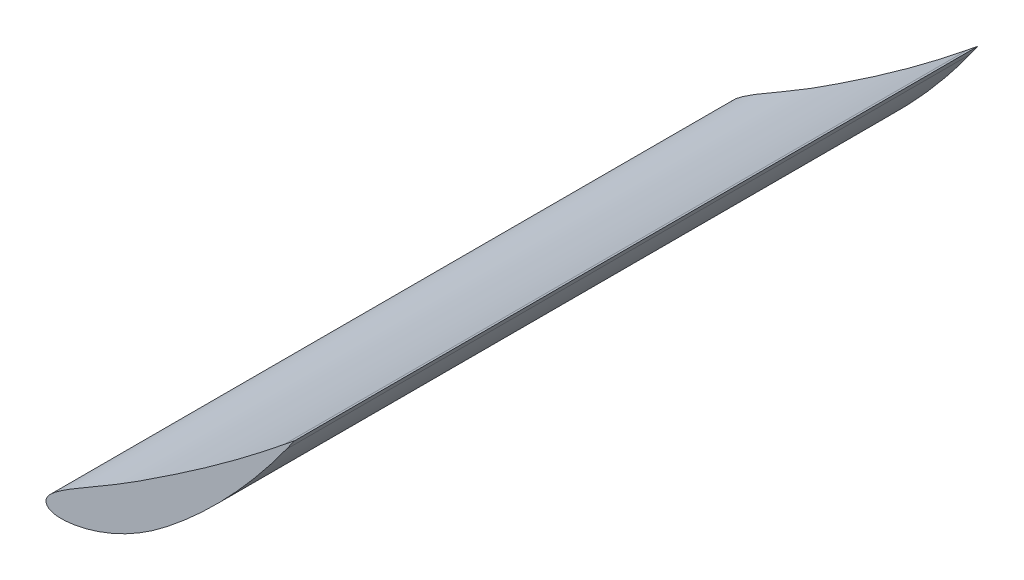
ISO-10303-21;
HEADER;
FILE_DESCRIPTION(('STEP AP214'),'2;1');
FILE_NAME('part.step','',(''),(''),'','','');
FILE_SCHEMA(('AUTOMOTIVE_DESIGN { 1 0 10303 214 1 1 1 1 }'));
ENDSEC;
DATA;
#1=APPLICATION_CONTEXT('core data for automotive mechanical design processes');
#2=APPLICATION_PROTOCOL_DEFINITION('international standard','automotive_design',2000,#1);
#3=PRODUCT_CONTEXT('',#1,'mechanical');
#4=PRODUCT('Part','Part','',(#3));
#5=PRODUCT_RELATED_PRODUCT_CATEGORY('part','',(#4));
#6=PRODUCT_DEFINITION_FORMATION('','',#4);
#7=PRODUCT_DEFINITION_CONTEXT('part definition',#1,'design');
#8=PRODUCT_DEFINITION('design','',#6,#7);
#9=PRODUCT_DEFINITION_SHAPE('','',#8);
#10=(LENGTH_UNIT() NAMED_UNIT(*) SI_UNIT(.MILLI.,.METRE.));
#11=(NAMED_UNIT(*) PLANE_ANGLE_UNIT() SI_UNIT($,.RADIAN.));
#12=(NAMED_UNIT(*) SI_UNIT($,.STERADIAN.) SOLID_ANGLE_UNIT());
#13=UNCERTAINTY_MEASURE_WITH_UNIT(LENGTH_MEASURE(1.E-05),#10,'distance_accuracy_value','');
#14=(GEOMETRIC_REPRESENTATION_CONTEXT(3) GLOBAL_UNCERTAINTY_ASSIGNED_CONTEXT((#13)) GLOBAL_UNIT_ASSIGNED_CONTEXT((#10,
#11,#12)) REPRESENTATION_CONTEXT('',''));
#15=CARTESIAN_POINT('',(0.,0.,0.));
#16=DIRECTION('',(0.,0.,1.));
#17=DIRECTION('',(1.,0.,0.));
#18=AXIS2_PLACEMENT_3D('',#15,#16,#17);
#19=CARTESIAN_POINT('',(154.117737428427,111.973090561717,425.45));
#20=DIRECTION('',(-0.811249289421065,0.584700427923409,0.));
#21=DIRECTION('',(-0.584700427923409,-0.811249289421065,0.));
#22=AXIS2_PLACEMENT_3D('',#19,#20,#21);
#23=PLANE('',#22);
#24=DIRECTION('',(0.584700427923409,0.811249289421065,0.));
#25=VECTOR('',#24,1.);
#26=CARTESIAN_POINT('',(154.117737428427,111.973090561717,0.));
#27=LINE('',#26,#25);
#28=CARTESIAN_POINT('',(148.978929372727,104.843192609591,0.));
#29=VERTEX_POINT('',#28);
#30=CARTESIAN_POINT('',(154.117737428427,111.973090561717,0.));
#31=VERTEX_POINT('',#30);
#32=EDGE_CURVE('E83',#29,#31,#27,.T.);
#33=ORIENTED_EDGE('',*,*,#32,.T.);
#34=DIRECTION('',(0.,0.,-1.));
#35=VECTOR('',#34,1.);
#36=CARTESIAN_POINT('',(154.117737428427,111.973090561717,425.45));
#37=LINE('',#36,#35);
#38=CARTESIAN_POINT('',(154.117737428427,111.973090561717,425.45));
#39=VERTEX_POINT('',#38);
#40=EDGE_CURVE('E11',#39,#31,#37,.T.);
#41=ORIENTED_EDGE('',*,*,#40,.F.);
#42=DIRECTION('',(0.584700427923409,0.811249289421065,0.));
#43=VECTOR('',#42,1.);
#44=CARTESIAN_POINT('',(154.117737428427,111.973090561717,425.45));
#45=LINE('',#44,#43);
#46=CARTESIAN_POINT('',(148.978929372727,104.843192609591,425.45));
#47=VERTEX_POINT('',#46);
#48=EDGE_CURVE('E76',#47,#39,#45,.T.);
#49=ORIENTED_EDGE('',*,*,#48,.F.);
#50=DIRECTION('',(0.,0.,-1.));
#51=VECTOR('',#50,1.);
#52=CARTESIAN_POINT('',(148.978929372727,104.843192609591,425.45));
#53=LINE('',#52,#51);
#54=EDGE_CURVE('E84',#47,#29,#53,.T.);
#55=ORIENTED_EDGE('',*,*,#54,.T.);
#56=EDGE_LOOP('',(#33,#41,#49,#55));
#57=FACE_BOUND('',#56,.T.);
#58=ADVANCED_FACE('F32',(#57),#23,.F.);
#59=CARTESIAN_POINT('',(147.626307276101,106.744492589674,425.45));
#60=DIRECTION('',(0.627285179942663,-0.7787896397772,0.));
#61=DIRECTION('',(0.7787896397772,0.627285179942663,0.));
#62=AXIS2_PLACEMENT_3D('',#59,#60,#61);
#63=PLANE('',#62);
#64=DIRECTION('',(-0.7787896397772,-0.627285179942663,0.));
#65=VECTOR('',#64,1.);
#66=CARTESIAN_POINT('',(147.626307276101,106.744492589674,0.));
#67=LINE('',#66,#65);
#68=CARTESIAN_POINT('',(147.626307276101,106.744492589674,0.));
#69=VERTEX_POINT('',#68);
#70=EDGE_CURVE('E63',#31,#69,#67,.T.);
#71=ORIENTED_EDGE('',*,*,#70,.T.);
#72=DIRECTION('',(0.,0.,-1.));
#73=VECTOR('',#72,1.);
#74=CARTESIAN_POINT('',(147.626307276101,106.744492589674,425.45));
#75=LINE('',#74,#73);
#76=CARTESIAN_POINT('',(147.626307276101,106.744492589674,425.45));
#77=VERTEX_POINT('',#76);
#78=EDGE_CURVE('E41',#77,#69,#75,.T.);
#79=ORIENTED_EDGE('',*,*,#78,.F.);
#80=DIRECTION('',(-0.7787896397772,-0.627285179942663,0.));
#81=VECTOR('',#80,1.);
#82=CARTESIAN_POINT('',(147.626307276101,106.744492589674,425.45));
#83=LINE('',#82,#81);
#84=EDGE_CURVE('E72',#39,#77,#83,.T.);
#85=ORIENTED_EDGE('',*,*,#84,.F.);
#86=ORIENTED_EDGE('',*,*,#40,.T.);
#87=EDGE_LOOP('',(#71,#79,#85,#86));
#88=FACE_BOUND('',#87,.T.);
#89=ADVANCED_FACE('F73',(#88),#63,.F.);
#90=CARTESIAN_POINT('',(147.626307276101,106.744492589674,425.45));
#91=CARTESIAN_POINT('',(146.098353984194,105.513784826366,425.45));
#92=CARTESIAN_POINT('',(144.569165148669,104.284633079708,425.45));
#93=CARTESIAN_POINT('',(141.502457945888,101.836819616725,425.45));
#94=CARTESIAN_POINT('',(139.965838234493,100.617026152838,425.45));
#95=CARTESIAN_POINT('',(135.344968314094,96.9715125048509,425.45));
#96=CARTESIAN_POINT('',(132.249876429888,94.5590041211748,425.45));
#97=CARTESIAN_POINT('',(122.924273702253,87.3833321399606,425.45));
#98=CARTESIAN_POINT('',(116.650353009387,82.6828780710158,425.45));
#99=CARTESIAN_POINT('',(103.986746324629,73.4516450364618,425.45));
#100=CARTESIAN_POINT('',(97.5964647558741,68.9217389970817,425.45));
#101=CARTESIAN_POINT('',(84.7150499344655,60.0097434059121,425.45));
#102=CARTESIAN_POINT('',(78.2237506484068,55.6278972062802,425.45));
#103=CARTESIAN_POINT('',(68.4409122691438,49.1223872433163,425.45));
#104=CARTESIAN_POINT('',(65.1708475858255,46.9672488261195,425.45));
#105=CARTESIAN_POINT('',(60.2650979434825,43.7354977297841,425.45));
#106=CARTESIAN_POINT('',(58.629171024452,42.6592396870466,425.45));
#107=CARTESIAN_POINT('',(55.3422820377237,40.5287603468236,425.45));
#108=CARTESIAN_POINT('',(53.6908083219786,39.4752889626211,425.45));
#109=CARTESIAN_POINT('',(48.7154522656466,36.3455587273365,425.45));
#110=CARTESIAN_POINT('',(45.3708112889058,34.2997254335173,425.45));
#111=CARTESIAN_POINT('',(38.6415417223993,30.2666679664805,425.45));
#112=CARTESIAN_POINT('',(35.256761647643,28.2796504587057,425.45));
#113=CARTESIAN_POINT('',(28.4722582630213,24.3275792985344,425.45));
#114=CARTESIAN_POINT('',(25.0724170984412,22.3638403817618,425.45));
#115=CARTESIAN_POINT('',(19.9945392630352,19.3827751155694,425.45));
#116=CARTESIAN_POINT('',(18.3057472481522,18.3828748585042,425.45));
#117=CARTESIAN_POINT('',(14.9465330129445,16.3533111183139,425.45));
#118=CARTESIAN_POINT('',(13.2757108254748,15.3242956725152,425.45));
#119=CARTESIAN_POINT('',(9.97167863485428,13.2053245270165,425.45));
#120=CARTESIAN_POINT('',(8.33736461516238,12.1171575840595,425.45));
#121=CARTESIAN_POINT('',(5.94880445592435,10.3829773168753,425.45));
#122=CARTESIAN_POINT('',(5.16142779438567,9.78681188083183,425.45));
#123=CARTESIAN_POINT('',(3.63586239218922,8.54504487918185,425.45));
#124=CARTESIAN_POINT('',(2.89500344501447,7.90107545739773,425.45));
#125=CARTESIAN_POINT('',(1.85059190217169,6.86469933754495,425.45));
#126=CARTESIAN_POINT('',(1.51325941354706,6.50786318736356,425.45));
#127=CARTESIAN_POINT('',(0.872584972718312,5.75839852954751,425.45));
#128=CARTESIAN_POINT('',(0.567860040955635,5.36187655342543,425.45));
#129=CARTESIAN_POINT('',(0.0254515123767999,4.53191024436887,425.45));
#130=CARTESIAN_POINT('',(-0.21195346834967,4.098346429917,425.45));
#131=CARTESIAN_POINT('',(-0.476469831692342,3.39764984142383,425.45));
#132=CARTESIAN_POINT('',(-0.54860651272955,3.15742615238185,425.45));
#133=CARTESIAN_POINT('',(-0.651858839920077,2.67255261395395,425.45));
#134=CARTESIAN_POINT('',(-0.68355240714831,2.42645974328882,425.45));
#135=CARTESIAN_POINT('',(-0.69658321219649,1.92503748075381,425.45));
#136=CARTESIAN_POINT('',(-0.677054608031916,1.67589640151746,425.45));
#137=CARTESIAN_POINT('',(-0.582772016374995,1.19017567765427,425.45));
#138=CARTESIAN_POINT('',(-0.507847811361603,0.949440882340041,425.45));
#139=CARTESIAN_POINT('',(-0.311022460059789,0.490389135396366,425.45));
#140=CARTESIAN_POINT('',(-0.190581619283785,0.273645725762633,425.45));
#141=CARTESIAN_POINT('',(0.0924961660437389,-0.13535561468123,425.45));
#142=CARTESIAN_POINT('',(0.256756293023986,-0.328002206868956,425.45));
#143=CARTESIAN_POINT('',(0.610413751683379,-0.676850933765968,425.45));
#144=CARTESIAN_POINT('',(0.801080764490817,-0.835285770263998,425.45));
#145=CARTESIAN_POINT('',(1.20487256207022,-1.12620647707313,425.45));
#146=CARTESIAN_POINT('',(1.41854329929545,-1.25900009013123,425.45));
#147=CARTESIAN_POINT('',(2.07286748300366,-1.61603721911102,425.45));
#148=CARTESIAN_POINT('',(2.53203376660626,-1.80225497690797,425.45));
#149=CARTESIAN_POINT('',(3.47853226922255,-2.11110956761509,425.45));
#150=CARTESIAN_POINT('',(3.96204840389185,-2.23234094985012,425.45));
#151=CARTESIAN_POINT('',(4.93414273411528,-2.42490415646983,425.45));
#152=CARTESIAN_POINT('',(5.42440557391198,-2.4974980885381,425.45));
#153=CARTESIAN_POINT('',(6.41089641468461,-2.60916800182046,425.45));
#154=CARTESIAN_POINT('',(6.90771935519928,-2.64742656379008,425.45));
#155=CARTESIAN_POINT('',(7.89653524791351,-2.69662936720602,425.45));
#156=CARTESIAN_POINT('',(8.38993211149576,-2.70811778233041,425.45));
#157=CARTESIAN_POINT('',(9.86766456266158,-2.71070279776547,425.45));
#158=CARTESIAN_POINT('',(10.8495386684399,-2.66987582199132,425.45));
#159=CARTESIAN_POINT('',(12.8087489241341,-2.52936798051423,425.45));
#160=CARTESIAN_POINT('',(13.7860020607472,-2.42861049442259,425.45));
#161=CARTESIAN_POINT('',(15.7368827653259,-2.1800746113801,425.45));
#162=CARTESIAN_POINT('',(16.7104829669466,-2.03194129342144,425.45));
#163=CARTESIAN_POINT('',(18.6545415302227,-1.69492734547267,425.45));
#164=CARTESIAN_POINT('',(19.6251349407367,-1.50615091366707,425.45));
#165=CARTESIAN_POINT('',(22.515782133923,-0.88965712094402,425.45));
#166=CARTESIAN_POINT('',(24.4212011228361,-0.411653921721,425.45));
#167=CARTESIAN_POINT('',(30.084329941683,1.18656771349591,425.45));
#168=CARTESIAN_POINT('',(33.7894239667138,2.46941460301591,425.45));
#169=CARTESIAN_POINT('',(39.2614618042673,4.65827304076347,425.45));
#170=CARTESIAN_POINT('',(41.0736965564895,5.43388191008493,425.45));
#171=CARTESIAN_POINT('',(44.6581757502752,7.06398949504358,425.45));
#172=CARTESIAN_POINT('',(46.4259959685335,7.91633287313127,425.45));
#173=CARTESIAN_POINT('',(51.6615845193703,10.5770070299574,425.45));
#174=CARTESIAN_POINT('',(55.0616581292346,12.4887109614542,425.45));
#175=CARTESIAN_POINT('',(61.6997778112391,16.5595427998588,425.45));
#176=CARTESIAN_POINT('',(64.9379704598401,18.7184468773415,425.45));
#177=CARTESIAN_POINT('',(71.2638836552744,23.2660332917964,425.45));
#178=CARTESIAN_POINT('',(74.3452358429934,25.6644404246338,425.45));
#179=CARTESIAN_POINT('',(78.9168612838768,29.339018727002,425.45));
#180=CARTESIAN_POINT('',(80.4307567231194,30.5791176629518,425.45));
#181=CARTESIAN_POINT('',(83.4378123573359,33.0909792670795,425.45));
#182=CARTESIAN_POINT('',(84.9301163137859,34.3617251935857,425.45));
#183=CARTESIAN_POINT('',(92.3224891375479,40.7695991457865,425.45));
#184=CARTESIAN_POINT('',(98.0326081592559,46.0823941588525,425.45));
#185=CARTESIAN_POINT('',(109.105193623994,57.0261508661316,425.45));
#186=CARTESIAN_POINT('',(114.467092262731,62.6576322067351,425.45));
#187=CARTESIAN_POINT('',(124.871724714097,74.2126899842826,425.45));
#188=CARTESIAN_POINT('',(129.913950351075,80.1367314963339,425.45));
#189=CARTESIAN_POINT('',(137.241896692154,89.2382212699046,425.45));
#190=CARTESIAN_POINT('',(139.645008067604,92.3082352634462,425.45));
#191=CARTESIAN_POINT('',(143.190158093138,96.9677253976675,425.45));
#192=CARTESIAN_POINT('',(144.361898093126,98.5300192865691,425.45));
#193=CARTESIAN_POINT('',(146.68530524032,101.672977452923,425.45));
#194=CARTESIAN_POINT('',(147.834744685273,103.255680491702,425.45));
#195=CARTESIAN_POINT('',(148.978929372727,104.843192609591,425.45));
#196=B_SPLINE_CURVE_WITH_KNOTS('',3,(#90,#91,#92,#93,#94,#95,#96,#97,#98,#99,#100,#101,#102,
#103,#104,#105,#106,#107,#108,#109,#110,#111,#112,#113,#114,#115,#116,#117,#118,#119,#120,#121,
#122,#123,#124,#125,#126,#127,#128,#129,#130,#131,#132,#133,#134,#135,#136,#137,#138,#139,#140,
#141,#142,#143,#144,#145,#146,#147,#148,#149,#150,#151,#152,#153,#154,#155,#156,#157,#158,#159,
#160,#161,#162,#163,#164,#165,#166,#167,#168,#169,#170,#171,#172,#173,#174,#175,#176,#177,#178,
#179,#180,#181,#182,#183,#184,#185,#186,#187,#188,#189,#190,#191,#192,#193,#194,#195),
.UNSPECIFIED.,.F.,.F.,(4,2,2,2,2,2,2,2,2,2,2,2,2,2,2,2,2,2,2,2,2,2,2,2,2,2,2,2,2,2,2,2,2,2,2,2,
2,2,2,2,2,2,2,2,2,2,2,2,2,2,2,2,4),(0.,0.0156250000000021,0.0312500000000041,0.0625000000000074,
0.125000000000013,0.187500000000019,0.250000000000025,0.281250000000028,0.29687500000003,
0.312500000000031,0.343750000000034,0.375000000000038,0.406250000000041,0.421875000000042,
0.437500000000043,0.453125000000045,0.460937500000045,0.468750000000046,0.472656250000046,
0.476562500000047,0.480468750000047,0.482421875000047,0.484375000000047,0.486328125000047,
0.488281250000047,0.490234375000047,0.492187500000047,0.494140625000047,0.496093750000047,
0.500000000000047,0.503906250000047,0.507812500000047,0.511718750000046,0.515625000000046,
0.523437500000045,0.531250000000044,0.539062500000044,0.546875000000043,0.562500000000041,
0.593750000000038,0.609375000000036,0.625000000000034,0.656250000000031,0.687500000000028,
0.718750000000026,0.734375000000024,0.750000000000023,0.812500000000017,0.875000000000011,
0.937500000000006,0.968750000000003,0.984375000000001,1.),.UNSPECIFIED.);
#197=DIRECTION('',(0.,0.,-1.));
#198=VECTOR('',#197,1.);
#199=SURFACE_OF_LINEAR_EXTRUSION('',#196,#198);
#200=CARTESIAN_POINT('',(147.626307276101,106.744492589674,0.));
#201=CARTESIAN_POINT('',(146.098353984194,105.513784826366,0.));
#202=CARTESIAN_POINT('',(144.569165148669,104.284633079708,0.));
#203=CARTESIAN_POINT('',(141.502457945888,101.836819616725,0.));
#204=CARTESIAN_POINT('',(139.965838234493,100.617026152838,0.));
#205=CARTESIAN_POINT('',(135.344968314094,96.9715125048509,0.));
#206=CARTESIAN_POINT('',(132.249876429888,94.5590041211748,0.));
#207=CARTESIAN_POINT('',(122.924273702253,87.3833321399606,0.));
#208=CARTESIAN_POINT('',(116.650353009387,82.6828780710158,0.));
#209=CARTESIAN_POINT('',(103.986746324629,73.4516450364618,0.));
#210=CARTESIAN_POINT('',(97.5964647558741,68.9217389970817,0.));
#211=CARTESIAN_POINT('',(84.7150499344655,60.0097434059121,0.));
#212=CARTESIAN_POINT('',(78.2237506484068,55.6278972062802,0.));
#213=CARTESIAN_POINT('',(68.4409122691438,49.1223872433163,0.));
#214=CARTESIAN_POINT('',(65.1708475858255,46.9672488261195,0.));
#215=CARTESIAN_POINT('',(60.2650979434825,43.7354977297841,0.));
#216=CARTESIAN_POINT('',(58.629171024452,42.6592396870466,0.));
#217=CARTESIAN_POINT('',(55.3422820377237,40.5287603468236,0.));
#218=CARTESIAN_POINT('',(53.6908083219786,39.4752889626211,0.));
#219=CARTESIAN_POINT('',(48.7154522656466,36.3455587273365,0.));
#220=CARTESIAN_POINT('',(45.3708112889058,34.2997254335173,0.));
#221=CARTESIAN_POINT('',(38.6415417223993,30.2666679664805,0.));
#222=CARTESIAN_POINT('',(35.256761647643,28.2796504587057,0.));
#223=CARTESIAN_POINT('',(28.4722582630213,24.3275792985344,0.));
#224=CARTESIAN_POINT('',(25.0724170984412,22.3638403817618,0.));
#225=CARTESIAN_POINT('',(19.9945392630352,19.3827751155694,0.));
#226=CARTESIAN_POINT('',(18.3057472481522,18.3828748585042,0.));
#227=CARTESIAN_POINT('',(14.9465330129445,16.3533111183139,0.));
#228=CARTESIAN_POINT('',(13.2757108254748,15.3242956725152,0.));
#229=CARTESIAN_POINT('',(9.97167863485428,13.2053245270165,0.));
#230=CARTESIAN_POINT('',(8.33736461516238,12.1171575840595,0.));
#231=CARTESIAN_POINT('',(5.94880445592435,10.3829773168753,0.));
#232=CARTESIAN_POINT('',(5.16142779438567,9.78681188083183,0.));
#233=CARTESIAN_POINT('',(3.63586239218922,8.54504487918185,0.));
#234=CARTESIAN_POINT('',(2.89500344501447,7.90107545739773,0.));
#235=CARTESIAN_POINT('',(1.85059190217169,6.86469933754495,0.));
#236=CARTESIAN_POINT('',(1.51325941354706,6.50786318736356,0.));
#237=CARTESIAN_POINT('',(0.872584972718312,5.75839852954751,0.));
#238=CARTESIAN_POINT('',(0.567860040955635,5.36187655342543,0.));
#239=CARTESIAN_POINT('',(0.0254515123767999,4.53191024436887,0.));
#240=CARTESIAN_POINT('',(-0.21195346834967,4.098346429917,0.));
#241=CARTESIAN_POINT('',(-0.476469831692342,3.39764984142383,0.));
#242=CARTESIAN_POINT('',(-0.54860651272955,3.15742615238185,0.));
#243=CARTESIAN_POINT('',(-0.651858839920077,2.67255261395395,0.));
#244=CARTESIAN_POINT('',(-0.68355240714831,2.42645974328882,0.));
#245=CARTESIAN_POINT('',(-0.69658321219649,1.92503748075381,0.));
#246=CARTESIAN_POINT('',(-0.677054608031916,1.67589640151746,0.));
#247=CARTESIAN_POINT('',(-0.582772016374995,1.19017567765427,0.));
#248=CARTESIAN_POINT('',(-0.507847811361603,0.949440882340041,0.));
#249=CARTESIAN_POINT('',(-0.311022460059789,0.490389135396366,0.));
#250=CARTESIAN_POINT('',(-0.190581619283785,0.273645725762633,0.));
#251=CARTESIAN_POINT('',(0.0924961660437389,-0.13535561468123,0.));
#252=CARTESIAN_POINT('',(0.256756293023986,-0.328002206868956,0.));
#253=CARTESIAN_POINT('',(0.610413751683379,-0.676850933765968,0.));
#254=CARTESIAN_POINT('',(0.801080764490817,-0.835285770263998,0.));
#255=CARTESIAN_POINT('',(1.20487256207022,-1.12620647707313,0.));
#256=CARTESIAN_POINT('',(1.41854329929545,-1.25900009013123,0.));
#257=CARTESIAN_POINT('',(2.07286748300366,-1.61603721911102,0.));
#258=CARTESIAN_POINT('',(2.53203376660626,-1.80225497690797,0.));
#259=CARTESIAN_POINT('',(3.47853226922255,-2.11110956761509,0.));
#260=CARTESIAN_POINT('',(3.96204840389185,-2.23234094985012,0.));
#261=CARTESIAN_POINT('',(4.93414273411528,-2.42490415646983,0.));
#262=CARTESIAN_POINT('',(5.42440557391198,-2.4974980885381,0.));
#263=CARTESIAN_POINT('',(6.41089641468461,-2.60916800182046,0.));
#264=CARTESIAN_POINT('',(6.90771935519928,-2.64742656379008,0.));
#265=CARTESIAN_POINT('',(7.89653524791351,-2.69662936720602,0.));
#266=CARTESIAN_POINT('',(8.38993211149576,-2.70811778233041,0.));
#267=CARTESIAN_POINT('',(9.86766456266158,-2.71070279776547,0.));
#268=CARTESIAN_POINT('',(10.8495386684399,-2.66987582199132,0.));
#269=CARTESIAN_POINT('',(12.8087489241341,-2.52936798051423,0.));
#270=CARTESIAN_POINT('',(13.7860020607472,-2.42861049442259,0.));
#271=CARTESIAN_POINT('',(15.7368827653259,-2.1800746113801,0.));
#272=CARTESIAN_POINT('',(16.7104829669466,-2.03194129342144,0.));
#273=CARTESIAN_POINT('',(18.6545415302227,-1.69492734547267,0.));
#274=CARTESIAN_POINT('',(19.6251349407367,-1.50615091366707,0.));
#275=CARTESIAN_POINT('',(22.515782133923,-0.88965712094402,0.));
#276=CARTESIAN_POINT('',(24.4212011228361,-0.411653921721,0.));
#277=CARTESIAN_POINT('',(30.084329941683,1.18656771349591,0.));
#278=CARTESIAN_POINT('',(33.7894239667138,2.46941460301591,0.));
#279=CARTESIAN_POINT('',(39.2614618042673,4.65827304076347,0.));
#280=CARTESIAN_POINT('',(41.0736965564895,5.43388191008493,0.));
#281=CARTESIAN_POINT('',(44.6581757502752,7.06398949504358,0.));
#282=CARTESIAN_POINT('',(46.4259959685335,7.91633287313127,0.));
#283=CARTESIAN_POINT('',(51.6615845193703,10.5770070299574,0.));
#284=CARTESIAN_POINT('',(55.0616581292346,12.4887109614542,0.));
#285=CARTESIAN_POINT('',(61.6997778112391,16.5595427998588,0.));
#286=CARTESIAN_POINT('',(64.9379704598401,18.7184468773415,0.));
#287=CARTESIAN_POINT('',(71.2638836552744,23.2660332917964,0.));
#288=CARTESIAN_POINT('',(74.3452358429934,25.6644404246338,0.));
#289=CARTESIAN_POINT('',(78.9168612838768,29.339018727002,0.));
#290=CARTESIAN_POINT('',(80.4307567231194,30.5791176629518,0.));
#291=CARTESIAN_POINT('',(83.4378123573359,33.0909792670795,0.));
#292=CARTESIAN_POINT('',(84.9301163137859,34.3617251935857,0.));
#293=CARTESIAN_POINT('',(92.3224891375479,40.7695991457865,0.));
#294=CARTESIAN_POINT('',(98.0326081592559,46.0823941588525,0.));
#295=CARTESIAN_POINT('',(109.105193623994,57.0261508661316,0.));
#296=CARTESIAN_POINT('',(114.467092262731,62.6576322067351,0.));
#297=CARTESIAN_POINT('',(124.871724714097,74.2126899842826,0.));
#298=CARTESIAN_POINT('',(129.913950351075,80.1367314963339,0.));
#299=CARTESIAN_POINT('',(137.241896692154,89.2382212699046,0.));
#300=CARTESIAN_POINT('',(139.645008067604,92.3082352634462,0.));
#301=CARTESIAN_POINT('',(143.190158093138,96.9677253976675,0.));
#302=CARTESIAN_POINT('',(144.361898093126,98.5300192865691,0.));
#303=CARTESIAN_POINT('',(146.68530524032,101.672977452923,0.));
#304=CARTESIAN_POINT('',(147.834744685273,103.255680491702,0.));
#305=CARTESIAN_POINT('',(148.978929372727,104.843192609591,0.));
#306=B_SPLINE_CURVE_WITH_KNOTS('',3,(#200,#201,#202,#203,#204,#205,#206,#207,#208,#209,#210,
#211,#212,#213,#214,#215,#216,#217,#218,#219,#220,#221,#222,#223,#224,#225,#226,#227,#228,#229,
#230,#231,#232,#233,#234,#235,#236,#237,#238,#239,#240,#241,#242,#243,#244,#245,#246,#247,#248,
#249,#250,#251,#252,#253,#254,#255,#256,#257,#258,#259,#260,#261,#262,#263,#264,#265,#266,#267,
#268,#269,#270,#271,#272,#273,#274,#275,#276,#277,#278,#279,#280,#281,#282,#283,#284,#285,#286,
#287,#288,#289,#290,#291,#292,#293,#294,#295,#296,#297,#298,#299,#300,#301,#302,#303,#304,#305),
.UNSPECIFIED.,.F.,.F.,(4,2,2,2,2,2,2,2,2,2,2,2,2,2,2,2,2,2,2,2,2,2,2,2,2,2,2,2,2,2,2,2,2,2,2,2,
2,2,2,2,2,2,2,2,2,2,2,2,2,2,2,2,4),(0.,0.0156250000000021,0.0312500000000041,0.0625000000000074,
0.125000000000013,0.187500000000019,0.250000000000025,0.281250000000028,0.29687500000003,
0.312500000000031,0.343750000000034,0.375000000000038,0.406250000000041,0.421875000000042,
0.437500000000043,0.453125000000045,0.460937500000045,0.468750000000046,0.472656250000046,
0.476562500000047,0.480468750000047,0.482421875000047,0.484375000000047,0.486328125000047,
0.488281250000047,0.490234375000047,0.492187500000047,0.494140625000047,0.496093750000047,
0.500000000000047,0.503906250000047,0.507812500000047,0.511718750000046,0.515625000000046,
0.523437500000045,0.531250000000044,0.539062500000044,0.546875000000043,0.562500000000041,
0.593750000000038,0.609375000000036,0.625000000000034,0.656250000000031,0.687500000000028,
0.718750000000026,0.734375000000024,0.750000000000023,0.812500000000017,0.875000000000011,
0.937500000000006,0.968750000000003,0.984375000000001,1.),.UNSPECIFIED.);
#307=EDGE_CURVE('E68',#69,#29,#306,.T.);
#308=ORIENTED_EDGE('',*,*,#307,.T.);
#309=ORIENTED_EDGE('',*,*,#54,.F.);
#310=CARTESIAN_POINT('',(148.978929372727,104.843192609591,425.45));
#311=CARTESIAN_POINT('',(147.834744685273,103.255680491702,425.45));
#312=CARTESIAN_POINT('',(146.68530524032,101.672977452923,425.45));
#313=CARTESIAN_POINT('',(144.361898093126,98.5300192865691,425.45));
#314=CARTESIAN_POINT('',(143.190158093138,96.9677253976675,425.45));
#315=CARTESIAN_POINT('',(139.645008067604,92.3082352634462,425.45));
#316=CARTESIAN_POINT('',(137.241896692154,89.2382212699046,425.45));
#317=CARTESIAN_POINT('',(129.913950351075,80.1367314963339,425.45));
#318=CARTESIAN_POINT('',(124.871724714097,74.2126899842826,425.45));
#319=CARTESIAN_POINT('',(114.467092262731,62.6576322067351,425.45));
#320=CARTESIAN_POINT('',(109.105193623994,57.0261508661316,425.45));
#321=CARTESIAN_POINT('',(98.0326081592559,46.0823941588525,425.45));
#322=CARTESIAN_POINT('',(92.3224891375479,40.7695991457865,425.45));
#323=CARTESIAN_POINT('',(84.9301163137859,34.3617251935857,425.45));
#324=CARTESIAN_POINT('',(83.4378123573359,33.0909792670795,425.45));
#325=CARTESIAN_POINT('',(80.4307567231194,30.5791176629518,425.45));
#326=CARTESIAN_POINT('',(78.9168612838768,29.339018727002,425.45));
#327=CARTESIAN_POINT('',(74.3452358429934,25.6644404246338,425.45));
#328=CARTESIAN_POINT('',(71.2638836552744,23.2660332917964,425.45));
#329=CARTESIAN_POINT('',(64.9379704598401,18.7184468773415,425.45));
#330=CARTESIAN_POINT('',(61.6997778112391,16.5595427998588,425.45));
#331=CARTESIAN_POINT('',(55.0616581292346,12.4887109614542,425.45));
#332=CARTESIAN_POINT('',(51.6615845193703,10.5770070299574,425.45));
#333=CARTESIAN_POINT('',(46.4259959685335,7.91633287313127,425.45));
#334=CARTESIAN_POINT('',(44.6581757502752,7.06398949504358,425.45));
#335=CARTESIAN_POINT('',(41.0736965564895,5.43388191008493,425.45));
#336=CARTESIAN_POINT('',(39.2614618042673,4.65827304076347,425.45));
#337=CARTESIAN_POINT('',(33.7894239667138,2.46941460301591,425.45));
#338=CARTESIAN_POINT('',(30.084329941683,1.18656771349591,425.45));
#339=CARTESIAN_POINT('',(24.4212011228361,-0.411653921721,425.45));
#340=CARTESIAN_POINT('',(22.515782133923,-0.88965712094402,425.45));
#341=CARTESIAN_POINT('',(19.6251349407367,-1.50615091366707,425.45));
#342=CARTESIAN_POINT('',(18.6545415302227,-1.69492734547267,425.45));
#343=CARTESIAN_POINT('',(16.7104829669466,-2.03194129342144,425.45));
#344=CARTESIAN_POINT('',(15.7368827653259,-2.1800746113801,425.45));
#345=CARTESIAN_POINT('',(13.7860020607472,-2.42861049442259,425.45));
#346=CARTESIAN_POINT('',(12.8087489241341,-2.52936798051423,425.45));
#347=CARTESIAN_POINT('',(10.8495386684399,-2.66987582199132,425.45));
#348=CARTESIAN_POINT('',(9.86766456266158,-2.71070279776547,425.45));
#349=CARTESIAN_POINT('',(8.38993211149576,-2.70811778233041,425.45));
#350=CARTESIAN_POINT('',(7.89653524791351,-2.69662936720602,425.45));
#351=CARTESIAN_POINT('',(6.90771935519928,-2.64742656379008,425.45));
#352=CARTESIAN_POINT('',(6.41089641468461,-2.60916800182046,425.45));
#353=CARTESIAN_POINT('',(5.42440557391198,-2.4974980885381,425.45));
#354=CARTESIAN_POINT('',(4.93414273411528,-2.42490415646983,425.45));
#355=CARTESIAN_POINT('',(3.96204840389185,-2.23234094985012,425.45));
#356=CARTESIAN_POINT('',(3.47853226922255,-2.11110956761509,425.45));
#357=CARTESIAN_POINT('',(2.53203376660626,-1.80225497690797,425.45));
#358=CARTESIAN_POINT('',(2.07286748300366,-1.61603721911102,425.45));
#359=CARTESIAN_POINT('',(1.41854329929545,-1.25900009013123,425.45));
#360=CARTESIAN_POINT('',(1.20487256207022,-1.12620647707313,425.45));
#361=CARTESIAN_POINT('',(0.801080764490817,-0.835285770263998,425.45));
#362=CARTESIAN_POINT('',(0.610413751683379,-0.676850933765968,425.45));
#363=CARTESIAN_POINT('',(0.256756293023986,-0.328002206868956,425.45));
#364=CARTESIAN_POINT('',(0.0924961660437389,-0.13535561468123,425.45));
#365=CARTESIAN_POINT('',(-0.190581619283785,0.273645725762633,425.45));
#366=CARTESIAN_POINT('',(-0.311022460059789,0.490389135396366,425.45));
#367=CARTESIAN_POINT('',(-0.507847811361603,0.949440882340041,425.45));
#368=CARTESIAN_POINT('',(-0.582772016374995,1.19017567765427,425.45));
#369=CARTESIAN_POINT('',(-0.677054608031916,1.67589640151746,425.45));
#370=CARTESIAN_POINT('',(-0.69658321219649,1.92503748075381,425.45));
#371=CARTESIAN_POINT('',(-0.68355240714831,2.42645974328882,425.45));
#372=CARTESIAN_POINT('',(-0.651858839920077,2.67255261395395,425.45));
#373=CARTESIAN_POINT('',(-0.54860651272955,3.15742615238185,425.45));
#374=CARTESIAN_POINT('',(-0.476469831692342,3.39764984142383,425.45));
#375=CARTESIAN_POINT('',(-0.21195346834967,4.098346429917,425.45));
#376=CARTESIAN_POINT('',(0.0254515123767999,4.53191024436887,425.45));
#377=CARTESIAN_POINT('',(0.567860040955635,5.36187655342543,425.45));
#378=CARTESIAN_POINT('',(0.872584972718312,5.75839852954751,425.45));
#379=CARTESIAN_POINT('',(1.51325941354706,6.50786318736356,425.45));
#380=CARTESIAN_POINT('',(1.85059190217169,6.86469933754495,425.45));
#381=CARTESIAN_POINT('',(2.89500344501447,7.90107545739773,425.45));
#382=CARTESIAN_POINT('',(3.63586239218922,8.54504487918185,425.45));
#383=CARTESIAN_POINT('',(5.16142779438567,9.78681188083183,425.45));
#384=CARTESIAN_POINT('',(5.94880445592435,10.3829773168753,425.45));
#385=CARTESIAN_POINT('',(8.33736461516238,12.1171575840595,425.45));
#386=CARTESIAN_POINT('',(9.97167863485428,13.2053245270165,425.45));
#387=CARTESIAN_POINT('',(13.2757108254748,15.3242956725152,425.45));
#388=CARTESIAN_POINT('',(14.9465330129445,16.3533111183139,425.45));
#389=CARTESIAN_POINT('',(18.3057472481522,18.3828748585042,425.45));
#390=CARTESIAN_POINT('',(19.9945392630352,19.3827751155694,425.45));
#391=CARTESIAN_POINT('',(25.0724170984412,22.3638403817618,425.45));
#392=CARTESIAN_POINT('',(28.4722582630213,24.3275792985344,425.45));
#393=CARTESIAN_POINT('',(35.256761647643,28.2796504587057,425.45));
#394=CARTESIAN_POINT('',(38.6415417223993,30.2666679664805,425.45));
#395=CARTESIAN_POINT('',(45.3708112889058,34.2997254335173,425.45));
#396=CARTESIAN_POINT('',(48.7154522656466,36.3455587273365,425.45));
#397=CARTESIAN_POINT('',(53.6908083219786,39.4752889626211,425.45));
#398=CARTESIAN_POINT('',(55.3422820377237,40.5287603468236,425.45));
#399=CARTESIAN_POINT('',(58.629171024452,42.6592396870466,425.45));
#400=CARTESIAN_POINT('',(60.2650979434825,43.7354977297841,425.45));
#401=CARTESIAN_POINT('',(65.1708475858255,46.9672488261195,425.45));
#402=CARTESIAN_POINT('',(68.4409122691438,49.1223872433163,425.45));
#403=CARTESIAN_POINT('',(78.2237506484068,55.6278972062802,425.45));
#404=CARTESIAN_POINT('',(84.7150499344655,60.0097434059121,425.45));
#405=CARTESIAN_POINT('',(97.5964647558741,68.9217389970817,425.45));
#406=CARTESIAN_POINT('',(103.986746324629,73.4516450364618,425.45));
#407=CARTESIAN_POINT('',(116.650353009387,82.6828780710158,425.45));
#408=CARTESIAN_POINT('',(122.924273702253,87.3833321399606,425.45));
#409=CARTESIAN_POINT('',(132.249876429888,94.5590041211748,425.45));
#410=CARTESIAN_POINT('',(135.344968314094,96.9715125048509,425.45));
#411=CARTESIAN_POINT('',(139.965838234493,100.617026152838,425.45));
#412=CARTESIAN_POINT('',(141.502457945888,101.836819616725,425.45));
#413=CARTESIAN_POINT('',(144.569165148669,104.284633079708,425.45));
#414=CARTESIAN_POINT('',(146.098353984194,105.513784826366,425.45));
#415=CARTESIAN_POINT('',(147.626307276101,106.744492589674,425.45));
#416=B_SPLINE_CURVE_WITH_KNOTS('',3,(#310,#311,#312,#313,#314,#315,#316,#317,#318,#319,#320,
#321,#322,#323,#324,#325,#326,#327,#328,#329,#330,#331,#332,#333,#334,#335,#336,#337,#338,#339,
#340,#341,#342,#343,#344,#345,#346,#347,#348,#349,#350,#351,#352,#353,#354,#355,#356,#357,#358,
#359,#360,#361,#362,#363,#364,#365,#366,#367,#368,#369,#370,#371,#372,#373,#374,#375,#376,#377,
#378,#379,#380,#381,#382,#383,#384,#385,#386,#387,#388,#389,#390,#391,#392,#393,#394,#395,#396,
#397,#398,#399,#400,#401,#402,#403,#404,#405,#406,#407,#408,#409,#410,#411,#412,#413,#414,#415),
.UNSPECIFIED.,.F.,.F.,(4,2,2,2,2,2,2,2,2,2,2,2,2,2,2,2,2,2,2,2,2,2,2,2,2,2,2,2,2,2,2,2,2,2,2,2,
2,2,2,2,2,2,2,2,2,2,2,2,2,2,2,2,4),(0.,0.0156249999999987,0.0312499999999972,0.0624999999999943,
0.124999999999989,0.187499999999983,0.249999999999977,0.265624999999976,0.281249999999974,
0.312499999999972,0.343749999999969,0.374999999999966,0.390624999999964,0.406249999999962,
0.437499999999959,0.453124999999957,0.460937499999956,0.468749999999956,0.476562499999955,
0.484374999999954,0.488281249999954,0.492187499999953,0.496093749999953,0.499999999999953,
0.503906249999953,0.505859374999953,0.507812499999953,0.509765624999953,0.511718749999953,
0.513671874999953,0.515624999999953,0.517578124999953,0.519531249999953,0.523437499999953,
0.527343749999954,0.531249999999954,0.539062499999955,0.546874999999955,0.562499999999957,
0.578124999999958,0.593749999999959,0.624999999999962,0.656249999999966,0.687499999999969,
0.70312499999997,0.718749999999972,0.749999999999975,0.812499999999981,0.874999999999987,
0.937499999999993,0.968749999999996,0.984374999999998,1.),.UNSPECIFIED.);
#417=EDGE_CURVE('E50',#77,#47,#416,.F.);
#418=ORIENTED_EDGE('',*,*,#417,.F.);
#419=ORIENTED_EDGE('',*,*,#78,.T.);
#420=EDGE_LOOP('',(#308,#309,#418,#419));
#421=FACE_BOUND('',#420,.T.);
#422=ADVANCED_FACE('F106',(#421),#199,.F.);
#423=CARTESIAN_POINT('',(3.00528301789725,-1.95668227225593,425.45));
#424=DIRECTION('',(0.,0.,1.));
#425=DIRECTION('',(1.,0.,0.));
#426=AXIS2_PLACEMENT_3D('',#423,#424,#425);
#427=PLANE('',#426);
#428=ORIENTED_EDGE('',*,*,#48,.T.);
#429=ORIENTED_EDGE('',*,*,#84,.T.);
#430=ORIENTED_EDGE('',*,*,#417,.T.);
#431=EDGE_LOOP('',(#428,#429,#430));
#432=FACE_BOUND('',#431,.T.);
#433=ADVANCED_FACE('F79',(#432),#427,.T.);
#434=CARTESIAN_POINT('',(3.00528301789725,-1.95668227225593,0.));
#435=DIRECTION('',(0.,0.,1.));
#436=DIRECTION('',(1.,0.,0.));
#437=AXIS2_PLACEMENT_3D('',#434,#435,#436);
#438=PLANE('',#437);
#439=ORIENTED_EDGE('',*,*,#32,.F.);
#440=ORIENTED_EDGE('',*,*,#307,.F.);
#441=ORIENTED_EDGE('',*,*,#70,.F.);
#442=EDGE_LOOP('',(#439,#440,#441));
#443=FACE_BOUND('',#442,.T.);
#444=ADVANCED_FACE('F95',(#443),#438,.F.);
#445=CLOSED_SHELL('',(#58,#89,#422,#433,#444));
#446=MANIFOLD_SOLID_BREP('B2',#445);
#447=ADVANCED_BREP_SHAPE_REPRESENTATION('',(#18,#446),#14);
#448=SHAPE_DEFINITION_REPRESENTATION(#9,#447);
ENDSEC;
END-ISO-10303-21;
